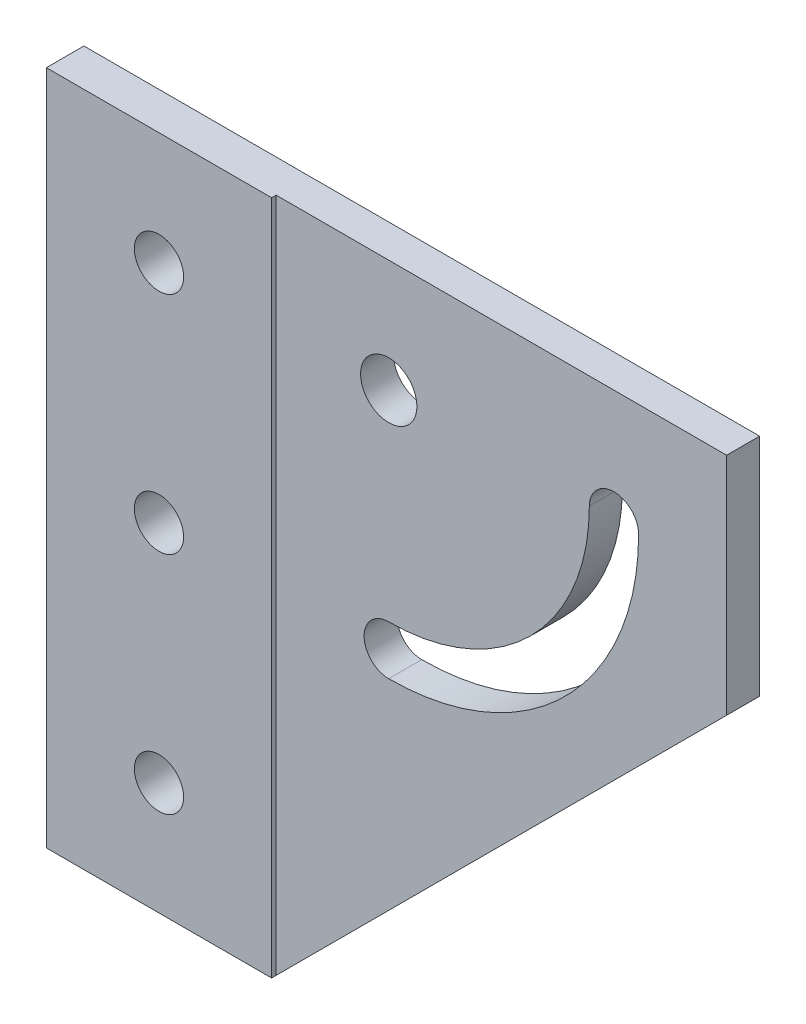
ISO-10303-21;
HEADER;
FILE_DESCRIPTION(('STEP AP214'),'2;1');
FILE_NAME('part.step','',(''),(''),'','','');
FILE_SCHEMA(('AUTOMOTIVE_DESIGN { 1 0 10303 214 1 1 1 1 }'));
ENDSEC;
DATA;
#1=APPLICATION_CONTEXT('core data for automotive mechanical design processes');
#2=APPLICATION_PROTOCOL_DEFINITION('international standard','automotive_design',2000,#1);
#3=PRODUCT_CONTEXT('',#1,'mechanical');
#4=PRODUCT('Part','Part','',(#3));
#5=PRODUCT_RELATED_PRODUCT_CATEGORY('part','',(#4));
#6=PRODUCT_DEFINITION_FORMATION('','',#4);
#7=PRODUCT_DEFINITION_CONTEXT('part definition',#1,'design');
#8=PRODUCT_DEFINITION('design','',#6,#7);
#9=PRODUCT_DEFINITION_SHAPE('','',#8);
#10=(LENGTH_UNIT() NAMED_UNIT(*) SI_UNIT(.MILLI.,.METRE.));
#11=(NAMED_UNIT(*) PLANE_ANGLE_UNIT() SI_UNIT($,.RADIAN.));
#12=(NAMED_UNIT(*) SI_UNIT($,.STERADIAN.) SOLID_ANGLE_UNIT());
#13=UNCERTAINTY_MEASURE_WITH_UNIT(LENGTH_MEASURE(1.E-05),#10,'distance_accuracy_value','');
#14=(GEOMETRIC_REPRESENTATION_CONTEXT(3) GLOBAL_UNCERTAINTY_ASSIGNED_CONTEXT((#13)) GLOBAL_UNIT_ASSIGNED_CONTEXT((#10,
#11,#12)) REPRESENTATION_CONTEXT('',''));
#15=CARTESIAN_POINT('',(0.,0.,0.));
#16=DIRECTION('',(0.,0.,1.));
#17=DIRECTION('',(1.,0.,0.));
#18=AXIS2_PLACEMENT_3D('',#15,#16,#17);
#19=CARTESIAN_POINT('',(47.8626023904694,85.0047435333209,-17.198296106889));
#20=DIRECTION('',(0.,0.,-1.));
#21=DIRECTION('',(-1.,0.,0.));
#22=AXIS2_PLACEMENT_3D('',#19,#20,#21);
#23=PLANE('',#22);
#24=DIRECTION('',(1.,0.,0.));
#25=VECTOR('',#24,1.);
#26=CARTESIAN_POINT('',(-66.4373976095305,85.0047435333209,-17.198296106889));
#27=LINE('',#26,#25);
#28=CARTESIAN_POINT('',(-66.4373976095305,85.0047435333209,-17.198296106889));
#29=VERTEX_POINT('',#28);
#30=CARTESIAN_POINT('',(47.8626023904694,85.0047435333209,-17.198296106889));
#31=VERTEX_POINT('',#30);
#32=EDGE_CURVE('E184',#29,#31,#27,.T.);
#33=ORIENTED_EDGE('',*,*,#32,.T.);
#34=DIRECTION('',(0.,-1.,0.));
#35=VECTOR('',#34,1.);
#36=CARTESIAN_POINT('',(47.8626023904694,85.0047435333209,-17.198296106889));
#37=LINE('',#36,#35);
#38=CARTESIAN_POINT('',(47.8626023904694,46.9047435333209,-17.198296106889));
#39=VERTEX_POINT('',#38);
#40=EDGE_CURVE('E188',#31,#39,#37,.T.);
#41=ORIENTED_EDGE('',*,*,#40,.T.);
#42=DIRECTION('',(-0.707106781186548,-0.707106781186548,0.));
#43=VECTOR('',#42,1.);
#44=CARTESIAN_POINT('',(47.8626023904694,46.9047435333209,-17.198296106889));
#45=LINE('',#44,#43);
#46=CARTESIAN_POINT('',(-28.3373976095306,-29.2952564666791,-17.198296106889));
#47=VERTEX_POINT('',#46);
#48=EDGE_CURVE('E194',#39,#47,#45,.T.);
#49=ORIENTED_EDGE('',*,*,#48,.T.);
#50=DIRECTION('',(-1.,0.,0.));
#51=VECTOR('',#50,1.);
#52=CARTESIAN_POINT('',(-28.3373976095306,-29.2952564666791,-17.198296106889));
#53=LINE('',#52,#51);
#54=CARTESIAN_POINT('',(-66.4373976095305,-29.2952564666791,-17.198296106889));
#55=VERTEX_POINT('',#54);
#56=EDGE_CURVE('E203',#47,#55,#53,.T.);
#57=ORIENTED_EDGE('',*,*,#56,.T.);
#58=DIRECTION('',(0.,1.,0.));
#59=VECTOR('',#58,1.);
#60=CARTESIAN_POINT('',(-66.4373976095305,-29.2952564666791,-17.198296106889));
#61=LINE('',#60,#59);
#62=EDGE_CURVE('E206',#55,#29,#61,.T.);
#63=ORIENTED_EDGE('',*,*,#62,.T.);
#64=EDGE_LOOP('',(#33,#41,#49,#57,#63));
#65=FACE_BOUND('',#64,.T.);
#66=CARTESIAN_POINT('',(-9.28739760953054,27.8547435333209,-17.198296106889));
#67=DIRECTION('',(0.,0.,1.));
#68=DIRECTION('',(1.,0.,0.));
#69=AXIS2_PLACEMENT_3D('',#66,#67,#68);
#70=CIRCLE('',#69,4.16559999999999);
#71=CARTESIAN_POINT('',(-9.28739760953053,32.0203435333209,-17.198296106889));
#72=VERTEX_POINT('',#71);
#73=CARTESIAN_POINT('',(-9.28739760953055,23.6891435333209,-17.198296106889));
#74=VERTEX_POINT('',#73);
#75=EDGE_CURVE('E119',#72,#74,#70,.T.);
#76=ORIENTED_EDGE('',*,*,#75,.T.);
#77=CARTESIAN_POINT('',(-9.28739760953054,65.9547435333209,-17.198296106889));
#78=DIRECTION('',(0.,0.,1.));
#79=DIRECTION('',(1.,0.,0.));
#80=AXIS2_PLACEMENT_3D('',#77,#78,#79);
#81=CIRCLE('',#80,42.2656);
#82=CARTESIAN_POINT('',(32.9782023904694,65.9547435333209,-17.198296106889));
#83=VERTEX_POINT('',#82);
#84=EDGE_CURVE('E128',#74,#83,#81,.T.);
#85=ORIENTED_EDGE('',*,*,#84,.T.);
#86=CARTESIAN_POINT('',(28.8126023904694,65.9547435333209,-17.198296106889));
#87=DIRECTION('',(0.,0.,1.));
#88=DIRECTION('',(1.,0.,0.));
#89=AXIS2_PLACEMENT_3D('',#86,#87,#88);
#90=CIRCLE('',#89,4.16559999999999);
#91=CARTESIAN_POINT('',(24.6470023904694,65.9547435333209,-17.198296106889));
#92=VERTEX_POINT('',#91);
#93=EDGE_CURVE('E61',#83,#92,#90,.T.);
#94=ORIENTED_EDGE('',*,*,#93,.T.);
#95=CARTESIAN_POINT('',(-9.28739760953054,65.9547435333209,-17.198296106889));
#96=DIRECTION('',(0.,0.,-1.));
#97=DIRECTION('',(-1.,0.,0.));
#98=AXIS2_PLACEMENT_3D('',#95,#96,#97);
#99=CIRCLE('',#98,33.9344);
#100=EDGE_CURVE('E125',#92,#72,#99,.T.);
#101=ORIENTED_EDGE('',*,*,#100,.T.);
#102=EDGE_LOOP('',(#76,#85,#94,#101));
#103=FACE_BOUND('',#102,.T.);
#104=CARTESIAN_POINT('',(-47.3873976095305,-10.2452564666791,-17.198296106889));
#105=DIRECTION('',(0.,0.,1.));
#106=DIRECTION('',(1.,0.,0.));
#107=AXIS2_PLACEMENT_3D('',#104,#105,#106);
#108=CIRCLE('',#107,4.16560000000001);
#109=CARTESIAN_POINT('',(-43.2217976095305,-10.2452564666791,-17.198296106889));
#110=VERTEX_POINT('',#109);
#111=EDGE_CURVE('E141',#110,#110,#108,.T.);
#112=ORIENTED_EDGE('',*,*,#111,.T.);
#113=EDGE_LOOP('',(#112));
#114=FACE_BOUND('',#113,.T.);
#115=CARTESIAN_POINT('',(-47.3873976095305,65.9547435333209,-17.198296106889));
#116=DIRECTION('',(0.,0.,1.));
#117=DIRECTION('',(1.,0.,0.));
#118=AXIS2_PLACEMENT_3D('',#115,#116,#117);
#119=CIRCLE('',#118,4.16560000000001);
#120=CARTESIAN_POINT('',(-43.2217976095305,65.9547435333209,-17.198296106889));
#121=VERTEX_POINT('',#120);
#122=EDGE_CURVE('E309',#121,#121,#119,.T.);
#123=ORIENTED_EDGE('',*,*,#122,.T.);
#124=EDGE_LOOP('',(#123));
#125=FACE_BOUND('',#124,.T.);
#126=CARTESIAN_POINT('',(-47.3873976095305,27.8547435333209,-17.198296106889));
#127=DIRECTION('',(0.,0.,1.));
#128=DIRECTION('',(1.,0.,0.));
#129=AXIS2_PLACEMENT_3D('',#126,#127,#128);
#130=CIRCLE('',#129,4.16560000000001);
#131=CARTESIAN_POINT('',(-43.2217976095305,27.8547435333209,-17.198296106889));
#132=VERTEX_POINT('',#131);
#133=EDGE_CURVE('E303',#132,#132,#130,.T.);
#134=ORIENTED_EDGE('',*,*,#133,.T.);
#135=EDGE_LOOP('',(#134));
#136=FACE_BOUND('',#135,.T.);
#137=CARTESIAN_POINT('',(-9.28739760953054,65.9547435333209,-17.198296106889));
#138=DIRECTION('',(0.,0.,1.));
#139=DIRECTION('',(1.,0.,0.));
#140=AXIS2_PLACEMENT_3D('',#137,#138,#139);
#141=CIRCLE('',#140,4.76249999999999);
#142=CARTESIAN_POINT('',(-4.52489760953055,65.9547435333209,-17.198296106889));
#143=VERTEX_POINT('',#142);
#144=EDGE_CURVE('E293',#143,#143,#141,.T.);
#145=ORIENTED_EDGE('',*,*,#144,.T.);
#146=EDGE_LOOP('',(#145));
#147=FACE_BOUND('',#146,.T.);
#148=ADVANCED_FACE('F36',(#65,#103,#114,#125,#136,#147),#23,.T.);
#149=CARTESIAN_POINT('',(47.8626023904694,85.0047435333209,-11.610296106889));
#150=DIRECTION('',(0.,0.,-1.));
#151=DIRECTION('',(-1.,0.,0.));
#152=AXIS2_PLACEMENT_3D('',#149,#150,#151);
#153=PLANE('',#152);
#154=CARTESIAN_POINT('',(-9.28739760953054,65.9547435333209,-11.610296106889));
#155=DIRECTION('',(0.,0.,1.));
#156=DIRECTION('',(1.,0.,0.));
#157=AXIS2_PLACEMENT_3D('',#154,#155,#156);
#158=CIRCLE('',#157,4.76249999999999);
#159=CARTESIAN_POINT('',(-4.52489760953055,65.9547435333209,-11.610296106889));
#160=VERTEX_POINT('',#159);
#161=EDGE_CURVE('E296',#160,#160,#158,.T.);
#162=ORIENTED_EDGE('',*,*,#161,.F.);
#163=EDGE_LOOP('',(#162));
#164=FACE_BOUND('',#163,.T.);
#165=CARTESIAN_POINT('',(-9.28739760953054,65.9547435333209,-11.610296106889));
#166=DIRECTION('',(0.,0.,1.));
#167=DIRECTION('',(1.,0.,0.));
#168=AXIS2_PLACEMENT_3D('',#165,#166,#167);
#169=CIRCLE('',#168,42.2656);
#170=CARTESIAN_POINT('',(-9.28739760953055,23.6891435333209,-11.610296106889));
#171=VERTEX_POINT('',#170);
#172=CARTESIAN_POINT('',(32.9782023904694,65.9547435333209,-11.610296106889));
#173=VERTEX_POINT('',#172);
#174=EDGE_CURVE('E148',#171,#173,#169,.T.);
#175=ORIENTED_EDGE('',*,*,#174,.F.);
#176=CARTESIAN_POINT('',(-9.28739760953054,27.8547435333209,-11.610296106889));
#177=DIRECTION('',(0.,0.,1.));
#178=DIRECTION('',(1.,0.,0.));
#179=AXIS2_PLACEMENT_3D('',#176,#177,#178);
#180=CIRCLE('',#179,4.16559999999999);
#181=CARTESIAN_POINT('',(-9.28739760953053,32.0203435333209,-11.610296106889));
#182=VERTEX_POINT('',#181);
#183=EDGE_CURVE('E53',#182,#171,#180,.T.);
#184=ORIENTED_EDGE('',*,*,#183,.F.);
#185=CARTESIAN_POINT('',(-9.28739760953054,65.9547435333209,-11.610296106889));
#186=DIRECTION('',(0.,0.,-1.));
#187=DIRECTION('',(-1.,0.,0.));
#188=AXIS2_PLACEMENT_3D('',#185,#186,#187);
#189=CIRCLE('',#188,33.9344);
#190=CARTESIAN_POINT('',(24.6470023904694,65.9547435333209,-11.610296106889));
#191=VERTEX_POINT('',#190);
#192=EDGE_CURVE('E135',#191,#182,#189,.T.);
#193=ORIENTED_EDGE('',*,*,#192,.F.);
#194=CARTESIAN_POINT('',(28.8126023904694,65.9547435333209,-11.610296106889));
#195=DIRECTION('',(0.,0.,1.));
#196=DIRECTION('',(1.,0.,0.));
#197=AXIS2_PLACEMENT_3D('',#194,#195,#196);
#198=CIRCLE('',#197,4.16559999999999);
#199=EDGE_CURVE('E138',#173,#191,#198,.T.);
#200=ORIENTED_EDGE('',*,*,#199,.F.);
#201=EDGE_LOOP('',(#175,#184,#193,#200));
#202=FACE_BOUND('',#201,.T.);
#203=DIRECTION('',(0.,1.,0.));
#204=VECTOR('',#203,1.);
#205=CARTESIAN_POINT('',(-28.3373976095306,85.0047435333209,-11.610296106889));
#206=LINE('',#205,#204);
#207=CARTESIAN_POINT('',(-28.3373976095306,-29.2952564666791,-11.610296106889));
#208=VERTEX_POINT('',#207);
#209=CARTESIAN_POINT('',(-28.3373976095306,85.0047435333209,-11.610296106889));
#210=VERTEX_POINT('',#209);
#211=EDGE_CURVE('E154',#208,#210,#206,.T.);
#212=ORIENTED_EDGE('',*,*,#211,.F.);
#213=DIRECTION('',(-0.707106781186548,-0.707106781186548,0.));
#214=VECTOR('',#213,1.);
#215=CARTESIAN_POINT('',(47.8626023904694,46.9047435333209,-11.610296106889));
#216=LINE('',#215,#214);
#217=CARTESIAN_POINT('',(47.8626023904694,46.9047435333209,-11.610296106889));
#218=VERTEX_POINT('',#217);
#219=EDGE_CURVE('E197',#218,#208,#216,.T.);
#220=ORIENTED_EDGE('',*,*,#219,.F.);
#221=DIRECTION('',(0.,-1.,0.));
#222=VECTOR('',#221,1.);
#223=CARTESIAN_POINT('',(47.8626023904694,85.0047435333209,-11.610296106889));
#224=LINE('',#223,#222);
#225=CARTESIAN_POINT('',(47.8626023904694,85.0047435333209,-11.610296106889));
#226=VERTEX_POINT('',#225);
#227=EDGE_CURVE('E217',#226,#218,#224,.T.);
#228=ORIENTED_EDGE('',*,*,#227,.F.);
#229=DIRECTION('',(1.,0.,0.));
#230=VECTOR('',#229,1.);
#231=CARTESIAN_POINT('',(-66.4373976095305,85.0047435333209,-11.610296106889));
#232=LINE('',#231,#230);
#233=EDGE_CURVE('E177',#210,#226,#232,.T.);
#234=ORIENTED_EDGE('',*,*,#233,.F.);
#235=EDGE_LOOP('',(#212,#220,#228,#234));
#236=FACE_BOUND('',#235,.T.);
#237=ADVANCED_FACE('F226',(#164,#202,#236),#153,.F.);
#238=CARTESIAN_POINT('',(-66.4373976095305,85.0047435333209,-11.610296106889));
#239=DIRECTION('',(0.,1.,0.));
#240=DIRECTION('',(0.,0.,1.));
#241=AXIS2_PLACEMENT_3D('',#238,#239,#240);
#242=PLANE('',#241);
#243=ORIENTED_EDGE('',*,*,#32,.F.);
#244=DIRECTION('',(0.,0.,-1.));
#245=VECTOR('',#244,1.);
#246=CARTESIAN_POINT('',(-66.4373976095305,85.0047435333209,-11.610296106889));
#247=LINE('',#246,#245);
#248=CARTESIAN_POINT('',(-66.4373976095305,85.0047435333209,-10.848296106889));
#249=VERTEX_POINT('',#248);
#250=EDGE_CURVE('E11',#249,#29,#247,.T.);
#251=ORIENTED_EDGE('',*,*,#250,.F.);
#252=DIRECTION('',(-1.,0.,0.));
#253=VECTOR('',#252,1.);
#254=CARTESIAN_POINT('',(-66.4373976095305,85.0047435333209,-10.848296106889));
#255=LINE('',#254,#253);
#256=CARTESIAN_POINT('',(-28.3373976095306,85.0047435333209,-10.848296106889));
#257=VERTEX_POINT('',#256);
#258=EDGE_CURVE('E163',#257,#249,#255,.T.);
#259=ORIENTED_EDGE('',*,*,#258,.F.);
#260=DIRECTION('',(0.,0.,-1.));
#261=VECTOR('',#260,1.);
#262=CARTESIAN_POINT('',(-28.3373976095306,85.0047435333209,-10.848296106889));
#263=LINE('',#262,#261);
#264=EDGE_CURVE('E169',#257,#210,#263,.T.);
#265=ORIENTED_EDGE('',*,*,#264,.T.);
#266=ORIENTED_EDGE('',*,*,#233,.T.);
#267=DIRECTION('',(0.,0.,-1.));
#268=VECTOR('',#267,1.);
#269=CARTESIAN_POINT('',(47.8626023904694,85.0047435333209,-11.610296106889));
#270=LINE('',#269,#268);
#271=EDGE_CURVE('E212',#226,#31,#270,.T.);
#272=ORIENTED_EDGE('',*,*,#271,.T.);
#273=EDGE_LOOP('',(#243,#251,#259,#265,#266,#272));
#274=FACE_BOUND('',#273,.T.);
#275=ADVANCED_FACE('F38',(#274),#242,.T.);
#276=CARTESIAN_POINT('',(-66.4373976095305,-29.2952564666791,-11.610296106889));
#277=DIRECTION('',(-1.,0.,0.));
#278=DIRECTION('',(0.,0.,1.));
#279=AXIS2_PLACEMENT_3D('',#276,#277,#278);
#280=PLANE('',#279);
#281=ORIENTED_EDGE('',*,*,#62,.F.);
#282=DIRECTION('',(0.,0.,-1.));
#283=VECTOR('',#282,1.);
#284=CARTESIAN_POINT('',(-66.4373976095305,-29.2952564666791,-11.610296106889));
#285=LINE('',#284,#283);
#286=CARTESIAN_POINT('',(-66.4373976095305,-29.2952564666791,-10.848296106889));
#287=VERTEX_POINT('',#286);
#288=EDGE_CURVE('E45',#287,#55,#285,.T.);
#289=ORIENTED_EDGE('',*,*,#288,.F.);
#290=DIRECTION('',(0.,-1.,0.));
#291=VECTOR('',#290,1.);
#292=CARTESIAN_POINT('',(-66.4373976095305,-29.2952564666791,-10.848296106889));
#293=LINE('',#292,#291);
#294=EDGE_CURVE('E166',#249,#287,#293,.T.);
#295=ORIENTED_EDGE('',*,*,#294,.F.);
#296=ORIENTED_EDGE('',*,*,#250,.T.);
#297=EDGE_LOOP('',(#281,#289,#295,#296));
#298=FACE_BOUND('',#297,.T.);
#299=ADVANCED_FACE('F243',(#298),#280,.T.);
#300=CARTESIAN_POINT('',(-28.3373976095306,-29.2952564666791,-11.610296106889));
#301=DIRECTION('',(0.,-1.,0.));
#302=DIRECTION('',(0.,0.,-1.));
#303=AXIS2_PLACEMENT_3D('',#300,#301,#302);
#304=PLANE('',#303);
#305=ORIENTED_EDGE('',*,*,#56,.F.);
#306=DIRECTION('',(0.,0.,-1.));
#307=VECTOR('',#306,1.);
#308=CARTESIAN_POINT('',(-28.3373976095306,-29.2952564666791,-11.610296106889));
#309=LINE('',#308,#307);
#310=EDGE_CURVE('E209',#208,#47,#309,.T.);
#311=ORIENTED_EDGE('',*,*,#310,.F.);
#312=DIRECTION('',(0.,0.,-1.));
#313=VECTOR('',#312,1.);
#314=CARTESIAN_POINT('',(-28.3373976095306,-29.2952564666791,-10.848296106889));
#315=LINE('',#314,#313);
#316=CARTESIAN_POINT('',(-28.3373976095306,-29.2952564666791,-10.848296106889));
#317=VERTEX_POINT('',#316);
#318=EDGE_CURVE('E172',#317,#208,#315,.T.);
#319=ORIENTED_EDGE('',*,*,#318,.F.);
#320=DIRECTION('',(1.,0.,0.));
#321=VECTOR('',#320,1.);
#322=CARTESIAN_POINT('',(-28.3373976095306,-29.2952564666791,-10.848296106889));
#323=LINE('',#322,#321);
#324=EDGE_CURVE('E158',#287,#317,#323,.T.);
#325=ORIENTED_EDGE('',*,*,#324,.F.);
#326=ORIENTED_EDGE('',*,*,#288,.T.);
#327=EDGE_LOOP('',(#305,#311,#319,#325,#326));
#328=FACE_BOUND('',#327,.T.);
#329=ADVANCED_FACE('F230',(#328),#304,.T.);
#330=CARTESIAN_POINT('',(47.8626023904694,46.9047435333209,-11.610296106889));
#331=DIRECTION('',(0.707106781186548,-0.707106781186548,0.));
#332=DIRECTION('',(0.707106781186548,0.707106781186548,0.));
#333=AXIS2_PLACEMENT_3D('',#330,#331,#332);
#334=PLANE('',#333);
#335=ORIENTED_EDGE('',*,*,#48,.F.);
#336=DIRECTION('',(0.,0.,-1.));
#337=VECTOR('',#336,1.);
#338=CARTESIAN_POINT('',(47.8626023904694,46.9047435333209,-11.610296106889));
#339=LINE('',#338,#337);
#340=EDGE_CURVE('E211',#218,#39,#339,.T.);
#341=ORIENTED_EDGE('',*,*,#340,.F.);
#342=ORIENTED_EDGE('',*,*,#219,.T.);
#343=ORIENTED_EDGE('',*,*,#310,.T.);
#344=EDGE_LOOP('',(#335,#341,#342,#343));
#345=FACE_BOUND('',#344,.T.);
#346=ADVANCED_FACE('F233',(#345),#334,.T.);
#347=CARTESIAN_POINT('',(47.8626023904694,85.0047435333209,-11.610296106889));
#348=DIRECTION('',(1.,0.,0.));
#349=DIRECTION('',(0.,0.,-1.));
#350=AXIS2_PLACEMENT_3D('',#347,#348,#349);
#351=PLANE('',#350);
#352=ORIENTED_EDGE('',*,*,#40,.F.);
#353=ORIENTED_EDGE('',*,*,#271,.F.);
#354=ORIENTED_EDGE('',*,*,#227,.T.);
#355=ORIENTED_EDGE('',*,*,#340,.T.);
#356=EDGE_LOOP('',(#352,#353,#354,#355));
#357=FACE_BOUND('',#356,.T.);
#358=ADVANCED_FACE('F225',(#357),#351,.T.);
#359=CARTESIAN_POINT('',(-28.3373976095306,85.0047435333209,-10.848296106889));
#360=DIRECTION('',(-1.,0.,0.));
#361=DIRECTION('',(0.,0.,1.));
#362=AXIS2_PLACEMENT_3D('',#359,#360,#361);
#363=PLANE('',#362);
#364=ORIENTED_EDGE('',*,*,#211,.T.);
#365=ORIENTED_EDGE('',*,*,#264,.F.);
#366=DIRECTION('',(0.,1.,0.));
#367=VECTOR('',#366,1.);
#368=CARTESIAN_POINT('',(-28.3373976095306,85.0047435333209,-10.848296106889));
#369=LINE('',#368,#367);
#370=EDGE_CURVE('E161',#317,#257,#369,.T.);
#371=ORIENTED_EDGE('',*,*,#370,.F.);
#372=ORIENTED_EDGE('',*,*,#318,.T.);
#373=EDGE_LOOP('',(#364,#365,#371,#372));
#374=FACE_BOUND('',#373,.T.);
#375=ADVANCED_FACE('F251',(#374),#363,.F.);
#376=CARTESIAN_POINT('',(-66.4373976095305,-29.2952564666791,-10.848296106889));
#377=DIRECTION('',(0.,0.,-1.));
#378=DIRECTION('',(-1.,0.,0.));
#379=AXIS2_PLACEMENT_3D('',#376,#377,#378);
#380=PLANE('',#379);
#381=CARTESIAN_POINT('',(-47.3873976095305,27.8547435333209,-10.848296106889));
#382=DIRECTION('',(0.,0.,1.));
#383=DIRECTION('',(1.,0.,0.));
#384=AXIS2_PLACEMENT_3D('',#381,#382,#383);
#385=CIRCLE('',#384,4.16560000000001);
#386=CARTESIAN_POINT('',(-43.2217976095305,27.8547435333209,-10.848296106889));
#387=VERTEX_POINT('',#386);
#388=EDGE_CURVE('E298',#387,#387,#385,.T.);
#389=ORIENTED_EDGE('',*,*,#388,.F.);
#390=EDGE_LOOP('',(#389));
#391=FACE_BOUND('',#390,.T.);
#392=CARTESIAN_POINT('',(-47.3873976095305,65.9547435333209,-10.848296106889));
#393=DIRECTION('',(0.,0.,1.));
#394=DIRECTION('',(1.,0.,0.));
#395=AXIS2_PLACEMENT_3D('',#392,#393,#394);
#396=CIRCLE('',#395,4.16560000000001);
#397=CARTESIAN_POINT('',(-43.2217976095305,65.9547435333209,-10.848296106889));
#398=VERTEX_POINT('',#397);
#399=EDGE_CURVE('E306',#398,#398,#396,.T.);
#400=ORIENTED_EDGE('',*,*,#399,.F.);
#401=EDGE_LOOP('',(#400));
#402=FACE_BOUND('',#401,.T.);
#403=CARTESIAN_POINT('',(-47.3873976095305,-10.2452564666791,-10.848296106889));
#404=DIRECTION('',(0.,0.,1.));
#405=DIRECTION('',(1.,0.,0.));
#406=AXIS2_PLACEMENT_3D('',#403,#404,#405);
#407=CIRCLE('',#406,4.16560000000001);
#408=CARTESIAN_POINT('',(-43.2217976095305,-10.2452564666791,-10.848296106889));
#409=VERTEX_POINT('',#408);
#410=EDGE_CURVE('E311',#409,#409,#407,.T.);
#411=ORIENTED_EDGE('',*,*,#410,.F.);
#412=EDGE_LOOP('',(#411));
#413=FACE_BOUND('',#412,.T.);
#414=ORIENTED_EDGE('',*,*,#324,.T.);
#415=ORIENTED_EDGE('',*,*,#370,.T.);
#416=ORIENTED_EDGE('',*,*,#258,.T.);
#417=ORIENTED_EDGE('',*,*,#294,.T.);
#418=EDGE_LOOP('',(#414,#415,#416,#417));
#419=FACE_BOUND('',#418,.T.);
#420=ADVANCED_FACE('F255',(#391,#402,#413,#419),#380,.F.);
#421=CARTESIAN_POINT('',(-9.28739760953054,27.8547435333209,-17.198296106889));
#422=DIRECTION('',(0.,0.,1.));
#423=DIRECTION('',(1.,0.,0.));
#424=AXIS2_PLACEMENT_3D('',#421,#422,#423);
#425=CYLINDRICAL_SURFACE('',#424,4.16559999999999);
#426=ORIENTED_EDGE('',*,*,#183,.T.);
#427=DIRECTION('',(0.,0.,1.));
#428=VECTOR('',#427,1.);
#429=CARTESIAN_POINT('',(-9.28739760953055,23.6891435333209,-17.198296106889));
#430=LINE('',#429,#428);
#431=EDGE_CURVE('E115',#74,#171,#430,.T.);
#432=ORIENTED_EDGE('',*,*,#431,.F.);
#433=ORIENTED_EDGE('',*,*,#75,.F.);
#434=DIRECTION('',(0.,0.,1.));
#435=VECTOR('',#434,1.);
#436=CARTESIAN_POINT('',(-9.28739760953053,32.0203435333209,-17.198296106889));
#437=LINE('',#436,#435);
#438=EDGE_CURVE('E152',#72,#182,#437,.T.);
#439=ORIENTED_EDGE('',*,*,#438,.T.);
#440=EDGE_LOOP('',(#426,#432,#433,#439));
#441=FACE_BOUND('',#440,.T.);
#442=ADVANCED_FACE('F117',(#441),#425,.F.);
#443=CARTESIAN_POINT('',(-9.28739760953054,65.9547435333209,-17.198296106889));
#444=DIRECTION('',(0.,0.,1.));
#445=DIRECTION('',(1.,0.,0.));
#446=AXIS2_PLACEMENT_3D('',#443,#444,#445);
#447=CYLINDRICAL_SURFACE('',#446,33.9344);
#448=ORIENTED_EDGE('',*,*,#192,.T.);
#449=ORIENTED_EDGE('',*,*,#438,.F.);
#450=ORIENTED_EDGE('',*,*,#100,.F.);
#451=DIRECTION('',(0.,0.,1.));
#452=VECTOR('',#451,1.);
#453=CARTESIAN_POINT('',(24.6470023904694,65.9547435333209,-17.198296106889));
#454=LINE('',#453,#452);
#455=EDGE_CURVE('E155',#92,#191,#454,.T.);
#456=ORIENTED_EDGE('',*,*,#455,.T.);
#457=EDGE_LOOP('',(#448,#449,#450,#456));
#458=FACE_BOUND('',#457,.T.);
#459=ADVANCED_FACE('F264',(#458),#447,.T.);
#460=CARTESIAN_POINT('',(28.8126023904694,65.9547435333209,-17.198296106889));
#461=DIRECTION('',(0.,0.,1.));
#462=DIRECTION('',(1.,0.,0.));
#463=AXIS2_PLACEMENT_3D('',#460,#461,#462);
#464=CYLINDRICAL_SURFACE('',#463,4.16559999999999);
#465=ORIENTED_EDGE('',*,*,#199,.T.);
#466=ORIENTED_EDGE('',*,*,#455,.F.);
#467=ORIENTED_EDGE('',*,*,#93,.F.);
#468=DIRECTION('',(0.,0.,1.));
#469=VECTOR('',#468,1.);
#470=CARTESIAN_POINT('',(32.9782023904694,65.9547435333209,-17.198296106889));
#471=LINE('',#470,#469);
#472=EDGE_CURVE('E124',#83,#173,#471,.T.);
#473=ORIENTED_EDGE('',*,*,#472,.T.);
#474=EDGE_LOOP('',(#465,#466,#467,#473));
#475=FACE_BOUND('',#474,.T.);
#476=ADVANCED_FACE('F268',(#475),#464,.F.);
#477=CARTESIAN_POINT('',(-9.28739760953054,65.9547435333209,-17.198296106889));
#478=DIRECTION('',(0.,0.,1.));
#479=DIRECTION('',(1.,0.,0.));
#480=AXIS2_PLACEMENT_3D('',#477,#478,#479);
#481=CYLINDRICAL_SURFACE('',#480,42.2656);
#482=ORIENTED_EDGE('',*,*,#174,.T.);
#483=ORIENTED_EDGE('',*,*,#472,.F.);
#484=ORIENTED_EDGE('',*,*,#84,.F.);
#485=ORIENTED_EDGE('',*,*,#431,.T.);
#486=EDGE_LOOP('',(#482,#483,#484,#485));
#487=FACE_BOUND('',#486,.T.);
#488=ADVANCED_FACE('F129',(#487),#481,.F.);
#489=CARTESIAN_POINT('',(-47.3873976095305,-10.2452564666791,-10.848296106889));
#490=DIRECTION('',(0.,0.,1.));
#491=DIRECTION('',(1.,0.,0.));
#492=AXIS2_PLACEMENT_3D('',#489,#490,#491);
#493=CYLINDRICAL_SURFACE('',#492,4.16560000000001);
#494=ORIENTED_EDGE('',*,*,#111,.F.);
#495=EDGE_LOOP('',(#494));
#496=FACE_BOUND('',#495,.T.);
#497=ORIENTED_EDGE('',*,*,#410,.T.);
#498=EDGE_LOOP('',(#497));
#499=FACE_BOUND('',#498,.T.);
#500=ADVANCED_FACE('F267',(#496,#499),#493,.F.);
#501=CARTESIAN_POINT('',(-47.3873976095305,65.9547435333209,-10.848296106889));
#502=DIRECTION('',(0.,0.,1.));
#503=DIRECTION('',(1.,0.,0.));
#504=AXIS2_PLACEMENT_3D('',#501,#502,#503);
#505=CYLINDRICAL_SURFACE('',#504,4.16560000000001);
#506=ORIENTED_EDGE('',*,*,#122,.F.);
#507=EDGE_LOOP('',(#506));
#508=FACE_BOUND('',#507,.T.);
#509=ORIENTED_EDGE('',*,*,#399,.T.);
#510=EDGE_LOOP('',(#509));
#511=FACE_BOUND('',#510,.T.);
#512=ADVANCED_FACE('F276',(#508,#511),#505,.F.);
#513=CARTESIAN_POINT('',(-47.3873976095305,27.8547435333209,-10.848296106889));
#514=DIRECTION('',(0.,0.,1.));
#515=DIRECTION('',(1.,0.,0.));
#516=AXIS2_PLACEMENT_3D('',#513,#514,#515);
#517=CYLINDRICAL_SURFACE('',#516,4.16560000000001);
#518=ORIENTED_EDGE('',*,*,#133,.F.);
#519=EDGE_LOOP('',(#518));
#520=FACE_BOUND('',#519,.T.);
#521=ORIENTED_EDGE('',*,*,#388,.T.);
#522=EDGE_LOOP('',(#521));
#523=FACE_BOUND('',#522,.T.);
#524=ADVANCED_FACE('F280',(#520,#523),#517,.F.);
#525=CARTESIAN_POINT('',(-9.28739760953054,65.9547435333209,-11.610296106889));
#526=DIRECTION('',(0.,0.,1.));
#527=DIRECTION('',(1.,0.,0.));
#528=AXIS2_PLACEMENT_3D('',#525,#526,#527);
#529=CYLINDRICAL_SURFACE('',#528,4.76249999999999);
#530=ORIENTED_EDGE('',*,*,#144,.F.);
#531=EDGE_LOOP('',(#530));
#532=FACE_BOUND('',#531,.T.);
#533=ORIENTED_EDGE('',*,*,#161,.T.);
#534=EDGE_LOOP('',(#533));
#535=FACE_BOUND('',#534,.T.);
#536=ADVANCED_FACE('F284',(#532,#535),#529,.F.);
#537=CLOSED_SHELL('',(#148,#237,#275,#299,#329,#346,#358,#375,#420,#442,#459,#476,#488,#500,
#512,#524,#536));
#538=MANIFOLD_SOLID_BREP('B2',#537);
#539=ADVANCED_BREP_SHAPE_REPRESENTATION('',(#18,#538),#14);
#540=SHAPE_DEFINITION_REPRESENTATION(#9,#539);
ENDSEC;
END-ISO-10303-21;
